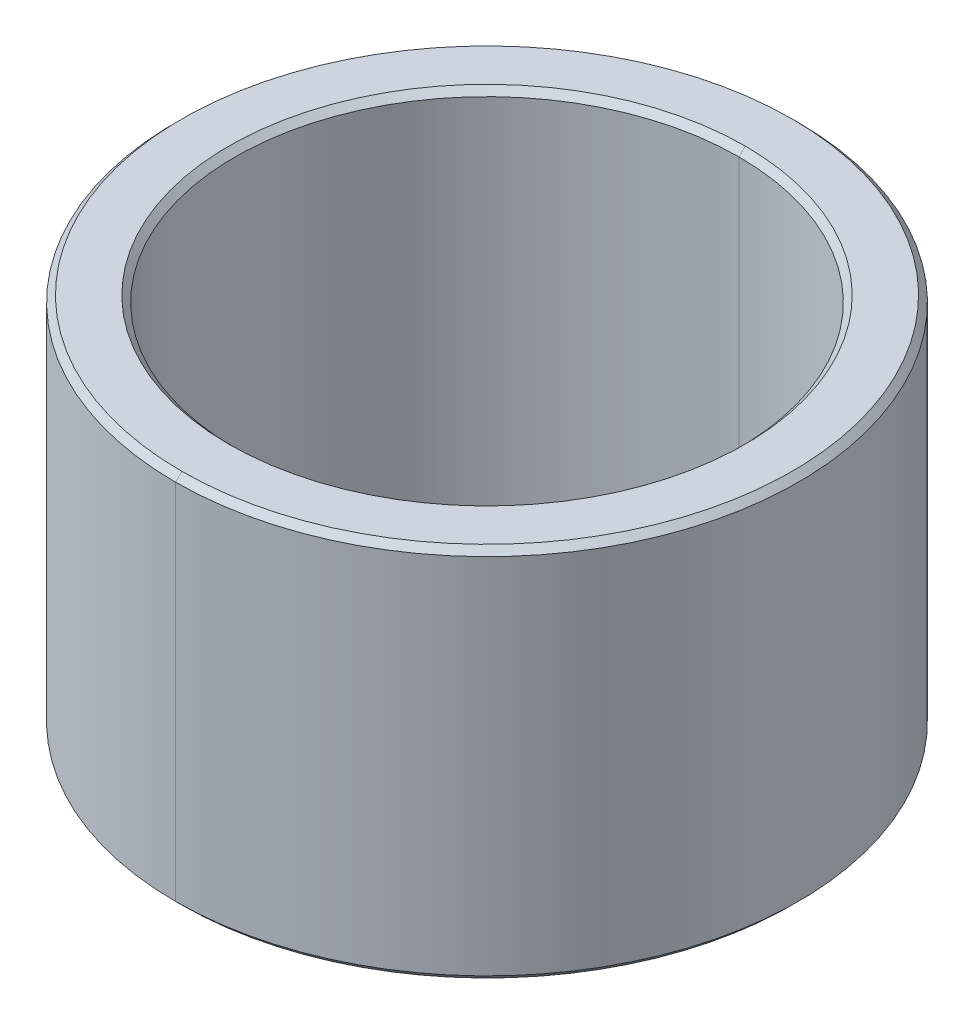
ISO-10303-21;
HEADER;
FILE_DESCRIPTION(('STEP AP214'),'2;1');
FILE_NAME('part.step','',(''),(''),'','','');
FILE_SCHEMA(('AUTOMOTIVE_DESIGN { 1 0 10303 214 1 1 1 1 }'));
ENDSEC;
DATA;
#1=APPLICATION_CONTEXT('core data for automotive mechanical design processes');
#2=APPLICATION_PROTOCOL_DEFINITION('international standard','automotive_design',2000,#1);
#3=PRODUCT_CONTEXT('',#1,'mechanical');
#4=PRODUCT('Part','Part','',(#3));
#5=PRODUCT_RELATED_PRODUCT_CATEGORY('part','',(#4));
#6=PRODUCT_DEFINITION_FORMATION('','',#4);
#7=PRODUCT_DEFINITION_CONTEXT('part definition',#1,'design');
#8=PRODUCT_DEFINITION('design','',#6,#7);
#9=PRODUCT_DEFINITION_SHAPE('','',#8);
#10=(LENGTH_UNIT() NAMED_UNIT(*) SI_UNIT(.MILLI.,.METRE.));
#11=(NAMED_UNIT(*) PLANE_ANGLE_UNIT() SI_UNIT($,.RADIAN.));
#12=(NAMED_UNIT(*) SI_UNIT($,.STERADIAN.) SOLID_ANGLE_UNIT());
#13=UNCERTAINTY_MEASURE_WITH_UNIT(LENGTH_MEASURE(1.E-05),#10,'distance_accuracy_value','');
#14=(GEOMETRIC_REPRESENTATION_CONTEXT(3) GLOBAL_UNCERTAINTY_ASSIGNED_CONTEXT((#13)) GLOBAL_UNIT_ASSIGNED_CONTEXT((#10,
#11,#12)) REPRESENTATION_CONTEXT('',''));
#15=CARTESIAN_POINT('',(0.,0.,0.));
#16=DIRECTION('',(0.,0.,1.));
#17=DIRECTION('',(1.,0.,0.));
#18=AXIS2_PLACEMENT_3D('',#15,#16,#17);
#19=CARTESIAN_POINT('',(0.,2.9,0.));
#20=DIRECTION('',(0.,1.,0.));
#21=DIRECTION('',(0.,0.,1.));
#22=AXIS2_PLACEMENT_3D('',#19,#20,#21);
#23=CONICAL_SURFACE('',#22,4.025,0.785398163397452);
#24=DIRECTION('',(0.,0.707106781186545,-0.707106781186551));
#25=VECTOR('',#24,1.);
#26=CARTESIAN_POINT('',(0.,2.9,-4.025));
#27=LINE('',#26,#25);
#28=CARTESIAN_POINT('',(0.,2.9,-4.025));
#29=VERTEX_POINT('',#28);
#30=CARTESIAN_POINT('',(0.,3.,-4.125));
#31=VERTEX_POINT('',#30);
#32=EDGE_CURVE('E218',#29,#31,#27,.T.);
#33=ORIENTED_EDGE('',*,*,#32,.F.);
#34=CARTESIAN_POINT('',(0.,2.9,0.));
#35=DIRECTION('',(0.,1.,0.));
#36=DIRECTION('',(0.,0.,1.));
#37=AXIS2_PLACEMENT_3D('',#34,#35,#36);
#38=CIRCLE('',#37,4.025);
#39=CARTESIAN_POINT('',(0.,2.9,4.025));
#40=VERTEX_POINT('',#39);
#41=EDGE_CURVE('E24',#40,#29,#38,.T.);
#42=ORIENTED_EDGE('',*,*,#41,.F.);
#43=DIRECTION('',(0.,0.707106781186545,0.707106781186551));
#44=VECTOR('',#43,1.);
#45=CARTESIAN_POINT('',(0.,2.9,4.025));
#46=LINE('',#45,#44);
#47=CARTESIAN_POINT('',(0.,3.,4.125));
#48=VERTEX_POINT('',#47);
#49=EDGE_CURVE('E204',#40,#48,#46,.T.);
#50=ORIENTED_EDGE('',*,*,#49,.T.);
#51=CARTESIAN_POINT('',(0.,3.,0.));
#52=DIRECTION('',(0.,-1.,0.));
#53=DIRECTION('',(0.,0.,1.));
#54=AXIS2_PLACEMENT_3D('',#51,#52,#53);
#55=CIRCLE('',#54,4.125);
#56=EDGE_CURVE('E110',#31,#48,#55,.T.);
#57=ORIENTED_EDGE('',*,*,#56,.F.);
#58=EDGE_LOOP('',(#33,#42,#50,#57));
#59=FACE_BOUND('',#58,.T.);
#60=ADVANCED_FACE('F15',(#59),#23,.F.);
#61=CARTESIAN_POINT('',(0.,-3.,0.));
#62=DIRECTION('',(0.,-1.,0.));
#63=DIRECTION('',(0.,0.,-1.));
#64=AXIS2_PLACEMENT_3D('',#61,#62,#63);
#65=CONICAL_SURFACE('',#64,4.125,0.785398163397452);
#66=DIRECTION('',(0.,-0.707106781186545,0.707106781186551));
#67=VECTOR('',#66,1.);
#68=CARTESIAN_POINT('',(0.,-3.,4.125));
#69=LINE('',#68,#67);
#70=CARTESIAN_POINT('',(0.,-2.9,4.025));
#71=VERTEX_POINT('',#70);
#72=CARTESIAN_POINT('',(0.,-3.,4.125));
#73=VERTEX_POINT('',#72);
#74=EDGE_CURVE('E185',#71,#73,#69,.T.);
#75=ORIENTED_EDGE('',*,*,#74,.F.);
#76=CARTESIAN_POINT('',(0.,-2.9,0.));
#77=DIRECTION('',(0.,-1.,0.));
#78=DIRECTION('',(0.,0.,1.));
#79=AXIS2_PLACEMENT_3D('',#76,#77,#78);
#80=CIRCLE('',#79,4.025);
#81=CARTESIAN_POINT('',(0.,-2.9,-4.025));
#82=VERTEX_POINT('',#81);
#83=EDGE_CURVE('E9',#82,#71,#80,.T.);
#84=ORIENTED_EDGE('',*,*,#83,.F.);
#85=DIRECTION('',(0.,-0.707106781186545,-0.707106781186551));
#86=VECTOR('',#85,1.);
#87=CARTESIAN_POINT('',(0.,-3.,-4.125));
#88=LINE('',#87,#86);
#89=CARTESIAN_POINT('',(0.,-3.,-4.125));
#90=VERTEX_POINT('',#89);
#91=EDGE_CURVE('E173',#82,#90,#88,.T.);
#92=ORIENTED_EDGE('',*,*,#91,.T.);
#93=CARTESIAN_POINT('',(0.,-3.,0.));
#94=DIRECTION('',(0.,1.,0.));
#95=DIRECTION('',(0.,0.,1.));
#96=AXIS2_PLACEMENT_3D('',#93,#94,#95);
#97=CIRCLE('',#96,4.125);
#98=EDGE_CURVE('E109',#73,#90,#97,.T.);
#99=ORIENTED_EDGE('',*,*,#98,.F.);
#100=EDGE_LOOP('',(#75,#84,#92,#99));
#101=FACE_BOUND('',#100,.T.);
#102=ADVANCED_FACE('F263',(#101),#65,.F.);
#103=CARTESIAN_POINT('',(0.,3.,0.));
#104=DIRECTION('',(0.,-1.,0.));
#105=DIRECTION('',(0.,0.,-1.));
#106=AXIS2_PLACEMENT_3D('',#103,#104,#105);
#107=CONICAL_SURFACE('',#106,4.875,0.785398163397452);
#108=DIRECTION('',(0.,-0.707106781186545,0.707106781186551));
#109=VECTOR('',#108,1.);
#110=CARTESIAN_POINT('',(0.,3.,4.875));
#111=LINE('',#110,#109);
#112=CARTESIAN_POINT('',(0.,3.,4.875));
#113=VERTEX_POINT('',#112);
#114=CARTESIAN_POINT('',(0.,2.9,4.975));
#115=VERTEX_POINT('',#114);
#116=EDGE_CURVE('E166',#113,#115,#111,.T.);
#117=ORIENTED_EDGE('',*,*,#116,.F.);
#118=CARTESIAN_POINT('',(0.,3.,0.));
#119=DIRECTION('',(0.,1.,0.));
#120=DIRECTION('',(0.,0.,1.));
#121=AXIS2_PLACEMENT_3D('',#118,#119,#120);
#122=CIRCLE('',#121,4.875);
#123=CARTESIAN_POINT('',(0.,3.,-4.875));
#124=VERTEX_POINT('',#123);
#125=EDGE_CURVE('E144',#124,#113,#122,.T.);
#126=ORIENTED_EDGE('',*,*,#125,.F.);
#127=DIRECTION('',(0.,-0.707106781186545,-0.707106781186551));
#128=VECTOR('',#127,1.);
#129=CARTESIAN_POINT('',(0.,3.,-4.875));
#130=LINE('',#129,#128);
#131=CARTESIAN_POINT('',(0.,2.9,-4.975));
#132=VERTEX_POINT('',#131);
#133=EDGE_CURVE('E122',#124,#132,#130,.T.);
#134=ORIENTED_EDGE('',*,*,#133,.T.);
#135=CARTESIAN_POINT('',(0.,2.9,0.));
#136=DIRECTION('',(0.,-1.,0.));
#137=DIRECTION('',(0.,0.,1.));
#138=AXIS2_PLACEMENT_3D('',#135,#136,#137);
#139=CIRCLE('',#138,4.975);
#140=EDGE_CURVE('E18',#115,#132,#139,.T.);
#141=ORIENTED_EDGE('',*,*,#140,.F.);
#142=EDGE_LOOP('',(#117,#126,#134,#141));
#143=FACE_BOUND('',#142,.T.);
#144=ADVANCED_FACE('F167',(#143),#107,.T.);
#145=CARTESIAN_POINT('',(0.,-2.9,0.));
#146=DIRECTION('',(0.,1.,0.));
#147=DIRECTION('',(0.,0.,1.));
#148=AXIS2_PLACEMENT_3D('',#145,#146,#147);
#149=CONICAL_SURFACE('',#148,4.975,0.785398163397443);
#150=DIRECTION('',(0.,0.707106781186551,-0.707106781186545));
#151=VECTOR('',#150,1.);
#152=CARTESIAN_POINT('',(0.,-2.9,-4.975));
#153=LINE('',#152,#151);
#154=CARTESIAN_POINT('',(0.,-3.,-4.875));
#155=VERTEX_POINT('',#154);
#156=CARTESIAN_POINT('',(0.,-2.9,-4.975));
#157=VERTEX_POINT('',#156);
#158=EDGE_CURVE('E112',#155,#157,#153,.T.);
#159=ORIENTED_EDGE('',*,*,#158,.F.);
#160=CARTESIAN_POINT('',(0.,-3.,0.));
#161=DIRECTION('',(0.,-1.,0.));
#162=DIRECTION('',(0.,0.,1.));
#163=AXIS2_PLACEMENT_3D('',#160,#161,#162);
#164=CIRCLE('',#163,4.875);
#165=CARTESIAN_POINT('',(0.,-3.,4.875));
#166=VERTEX_POINT('',#165);
#167=EDGE_CURVE('E103',#166,#155,#164,.T.);
#168=ORIENTED_EDGE('',*,*,#167,.F.);
#169=DIRECTION('',(0.,0.707106781186551,0.707106781186545));
#170=VECTOR('',#169,1.);
#171=CARTESIAN_POINT('',(0.,-2.9,4.975));
#172=LINE('',#171,#170);
#173=CARTESIAN_POINT('',(0.,-2.9,4.975));
#174=VERTEX_POINT('',#173);
#175=EDGE_CURVE('E120',#166,#174,#172,.T.);
#176=ORIENTED_EDGE('',*,*,#175,.T.);
#177=CARTESIAN_POINT('',(0.,-2.9,0.));
#178=DIRECTION('',(0.,1.,0.));
#179=DIRECTION('',(0.,0.,1.));
#180=AXIS2_PLACEMENT_3D('',#177,#178,#179);
#181=CIRCLE('',#180,4.975);
#182=EDGE_CURVE('E38',#157,#174,#181,.T.);
#183=ORIENTED_EDGE('',*,*,#182,.F.);
#184=EDGE_LOOP('',(#159,#168,#176,#183));
#185=FACE_BOUND('',#184,.T.);
#186=ADVANCED_FACE('F113',(#185),#149,.T.);
#187=CARTESIAN_POINT('',(0.,3.,0.));
#188=DIRECTION('',(0.,-1.,0.));
#189=DIRECTION('',(0.,0.,-1.));
#190=AXIS2_PLACEMENT_3D('',#187,#188,#189);
#191=CYLINDRICAL_SURFACE('',#190,4.025);
#192=DIRECTION('',(0.,-1.,0.));
#193=VECTOR('',#192,1.);
#194=CARTESIAN_POINT('',(0.,3.,4.025));
#195=LINE('',#194,#193);
#196=EDGE_CURVE('E134',#40,#71,#195,.T.);
#197=ORIENTED_EDGE('',*,*,#196,.F.);
#198=ORIENTED_EDGE('',*,*,#41,.T.);
#199=DIRECTION('',(0.,-1.,0.));
#200=VECTOR('',#199,1.);
#201=CARTESIAN_POINT('',(0.,3.,-4.025));
#202=LINE('',#201,#200);
#203=EDGE_CURVE('E138',#29,#82,#202,.T.);
#204=ORIENTED_EDGE('',*,*,#203,.T.);
#205=ORIENTED_EDGE('',*,*,#83,.T.);
#206=EDGE_LOOP('',(#197,#198,#204,#205));
#207=FACE_BOUND('',#206,.T.);
#208=ADVANCED_FACE('F245',(#207),#191,.F.);
#209=CARTESIAN_POINT('',(0.,3.,0.));
#210=DIRECTION('',(0.,-1.,0.));
#211=DIRECTION('',(0.,0.,-1.));
#212=AXIS2_PLACEMENT_3D('',#209,#210,#211);
#213=CYLINDRICAL_SURFACE('',#212,4.975);
#214=DIRECTION('',(0.,-1.,0.));
#215=VECTOR('',#214,1.);
#216=CARTESIAN_POINT('',(0.,3.,4.975));
#217=LINE('',#216,#215);
#218=EDGE_CURVE('E148',#115,#174,#217,.T.);
#219=ORIENTED_EDGE('',*,*,#218,.F.);
#220=ORIENTED_EDGE('',*,*,#140,.T.);
#221=DIRECTION('',(0.,-1.,0.));
#222=VECTOR('',#221,1.);
#223=CARTESIAN_POINT('',(0.,3.,-4.975));
#224=LINE('',#223,#222);
#225=EDGE_CURVE('E151',#132,#157,#224,.T.);
#226=ORIENTED_EDGE('',*,*,#225,.T.);
#227=ORIENTED_EDGE('',*,*,#182,.T.);
#228=EDGE_LOOP('',(#219,#220,#226,#227));
#229=FACE_BOUND('',#228,.T.);
#230=ADVANCED_FACE('F259',(#229),#213,.T.);
#231=CARTESIAN_POINT('',(0.,-3.,0.));
#232=DIRECTION('',(0.,1.,0.));
#233=DIRECTION('',(1.,0.,0.));
#234=AXIS2_PLACEMENT_3D('',#231,#232,#233);
#235=PLANE('',#234);
#236=CARTESIAN_POINT('',(0.,-3.,0.));
#237=DIRECTION('',(0.,1.,0.));
#238=DIRECTION('',(0.,0.,1.));
#239=AXIS2_PLACEMENT_3D('',#236,#237,#238);
#240=CIRCLE('',#239,4.125);
#241=EDGE_CURVE('E181',#90,#73,#240,.T.);
#242=ORIENTED_EDGE('',*,*,#241,.T.);
#243=ORIENTED_EDGE('',*,*,#98,.T.);
#244=EDGE_LOOP('',(#242,#243));
#245=FACE_BOUND('',#244,.T.);
#246=ORIENTED_EDGE('',*,*,#167,.T.);
#247=CARTESIAN_POINT('',(0.,-3.,0.));
#248=DIRECTION('',(0.,-1.,0.));
#249=DIRECTION('',(0.,0.,1.));
#250=AXIS2_PLACEMENT_3D('',#247,#248,#249);
#251=CIRCLE('',#250,4.875);
#252=EDGE_CURVE('E106',#155,#166,#251,.T.);
#253=ORIENTED_EDGE('',*,*,#252,.T.);
#254=EDGE_LOOP('',(#246,#253));
#255=FACE_BOUND('',#254,.T.);
#256=ADVANCED_FACE('F104',(#245,#255),#235,.F.);
#257=CARTESIAN_POINT('',(0.,3.,0.));
#258=DIRECTION('',(0.,1.,0.));
#259=DIRECTION('',(1.,0.,0.));
#260=AXIS2_PLACEMENT_3D('',#257,#258,#259);
#261=PLANE('',#260);
#262=CARTESIAN_POINT('',(0.,3.,0.));
#263=DIRECTION('',(0.,-1.,0.));
#264=DIRECTION('',(0.,0.,1.));
#265=AXIS2_PLACEMENT_3D('',#262,#263,#264);
#266=CIRCLE('',#265,4.125);
#267=EDGE_CURVE('E211',#48,#31,#266,.T.);
#268=ORIENTED_EDGE('',*,*,#267,.T.);
#269=ORIENTED_EDGE('',*,*,#56,.T.);
#270=EDGE_LOOP('',(#268,#269));
#271=FACE_BOUND('',#270,.T.);
#272=ORIENTED_EDGE('',*,*,#125,.T.);
#273=CARTESIAN_POINT('',(0.,3.,0.));
#274=DIRECTION('',(0.,1.,0.));
#275=DIRECTION('',(0.,0.,1.));
#276=AXIS2_PLACEMENT_3D('',#273,#274,#275);
#277=CIRCLE('',#276,4.875);
#278=EDGE_CURVE('E162',#113,#124,#277,.T.);
#279=ORIENTED_EDGE('',*,*,#278,.T.);
#280=EDGE_LOOP('',(#272,#279));
#281=FACE_BOUND('',#280,.T.);
#282=ADVANCED_FACE('F160',(#271,#281),#261,.T.);
#283=CARTESIAN_POINT('',(0.,3.,0.));
#284=DIRECTION('',(0.,-1.,0.));
#285=DIRECTION('',(0.,0.,-1.));
#286=AXIS2_PLACEMENT_3D('',#283,#284,#285);
#287=CYLINDRICAL_SURFACE('',#286,4.975);
#288=CARTESIAN_POINT('',(0.,2.9,0.));
#289=DIRECTION('',(0.,-1.,0.));
#290=DIRECTION('',(0.,0.,1.));
#291=AXIS2_PLACEMENT_3D('',#288,#289,#290);
#292=CIRCLE('',#291,4.975);
#293=EDGE_CURVE('E129',#132,#115,#292,.T.);
#294=ORIENTED_EDGE('',*,*,#293,.T.);
#295=ORIENTED_EDGE('',*,*,#218,.T.);
#296=CARTESIAN_POINT('',(0.,-2.9,0.));
#297=DIRECTION('',(0.,1.,0.));
#298=DIRECTION('',(0.,0.,1.));
#299=AXIS2_PLACEMENT_3D('',#296,#297,#298);
#300=CIRCLE('',#299,4.975);
#301=EDGE_CURVE('E117',#174,#157,#300,.T.);
#302=ORIENTED_EDGE('',*,*,#301,.T.);
#303=ORIENTED_EDGE('',*,*,#225,.F.);
#304=EDGE_LOOP('',(#294,#295,#302,#303));
#305=FACE_BOUND('',#304,.T.);
#306=ADVANCED_FACE('F250',(#305),#287,.T.);
#307=CARTESIAN_POINT('',(0.,3.,0.));
#308=DIRECTION('',(0.,-1.,0.));
#309=DIRECTION('',(0.,0.,-1.));
#310=AXIS2_PLACEMENT_3D('',#307,#308,#309);
#311=CYLINDRICAL_SURFACE('',#310,4.025);
#312=CARTESIAN_POINT('',(0.,2.9,0.));
#313=DIRECTION('',(0.,1.,0.));
#314=DIRECTION('',(0.,0.,1.));
#315=AXIS2_PLACEMENT_3D('',#312,#313,#314);
#316=CIRCLE('',#315,4.025);
#317=EDGE_CURVE('E223',#29,#40,#316,.T.);
#318=ORIENTED_EDGE('',*,*,#317,.T.);
#319=ORIENTED_EDGE('',*,*,#196,.T.);
#320=CARTESIAN_POINT('',(0.,-2.9,0.));
#321=DIRECTION('',(0.,-1.,0.));
#322=DIRECTION('',(0.,0.,1.));
#323=AXIS2_PLACEMENT_3D('',#320,#321,#322);
#324=CIRCLE('',#323,4.025);
#325=EDGE_CURVE('E196',#71,#82,#324,.T.);
#326=ORIENTED_EDGE('',*,*,#325,.T.);
#327=ORIENTED_EDGE('',*,*,#203,.F.);
#328=EDGE_LOOP('',(#318,#319,#326,#327));
#329=FACE_BOUND('',#328,.T.);
#330=ADVANCED_FACE('F234',(#329),#311,.F.);
#331=CARTESIAN_POINT('',(0.,-2.9,0.));
#332=DIRECTION('',(0.,1.,0.));
#333=DIRECTION('',(0.,0.,1.));
#334=AXIS2_PLACEMENT_3D('',#331,#332,#333);
#335=CONICAL_SURFACE('',#334,4.975,0.785398163397443);
#336=ORIENTED_EDGE('',*,*,#252,.F.);
#337=ORIENTED_EDGE('',*,*,#158,.T.);
#338=ORIENTED_EDGE('',*,*,#301,.F.);
#339=ORIENTED_EDGE('',*,*,#175,.F.);
#340=EDGE_LOOP('',(#336,#337,#338,#339));
#341=FACE_BOUND('',#340,.T.);
#342=ADVANCED_FACE('F119',(#341),#335,.T.);
#343=CARTESIAN_POINT('',(0.,3.,0.));
#344=DIRECTION('',(0.,-1.,0.));
#345=DIRECTION('',(0.,0.,-1.));
#346=AXIS2_PLACEMENT_3D('',#343,#344,#345);
#347=CONICAL_SURFACE('',#346,4.875,0.785398163397452);
#348=ORIENTED_EDGE('',*,*,#278,.F.);
#349=ORIENTED_EDGE('',*,*,#116,.T.);
#350=ORIENTED_EDGE('',*,*,#293,.F.);
#351=ORIENTED_EDGE('',*,*,#133,.F.);
#352=EDGE_LOOP('',(#348,#349,#350,#351));
#353=FACE_BOUND('',#352,.T.);
#354=ADVANCED_FACE('F171',(#353),#347,.T.);
#355=CARTESIAN_POINT('',(0.,-3.,0.));
#356=DIRECTION('',(0.,-1.,0.));
#357=DIRECTION('',(0.,0.,-1.));
#358=AXIS2_PLACEMENT_3D('',#355,#356,#357);
#359=CONICAL_SURFACE('',#358,4.125,0.785398163397452);
#360=ORIENTED_EDGE('',*,*,#325,.F.);
#361=ORIENTED_EDGE('',*,*,#74,.T.);
#362=ORIENTED_EDGE('',*,*,#241,.F.);
#363=ORIENTED_EDGE('',*,*,#91,.F.);
#364=EDGE_LOOP('',(#360,#361,#362,#363));
#365=FACE_BOUND('',#364,.T.);
#366=ADVANCED_FACE('F274',(#365),#359,.F.);
#367=CARTESIAN_POINT('',(0.,2.9,0.));
#368=DIRECTION('',(0.,1.,0.));
#369=DIRECTION('',(0.,0.,1.));
#370=AXIS2_PLACEMENT_3D('',#367,#368,#369);
#371=CONICAL_SURFACE('',#370,4.025,0.785398163397452);
#372=ORIENTED_EDGE('',*,*,#317,.F.);
#373=ORIENTED_EDGE('',*,*,#32,.T.);
#374=ORIENTED_EDGE('',*,*,#267,.F.);
#375=ORIENTED_EDGE('',*,*,#49,.F.);
#376=EDGE_LOOP('',(#372,#373,#374,#375));
#377=FACE_BOUND('',#376,.T.);
#378=ADVANCED_FACE('F239',(#377),#371,.F.);
#379=CLOSED_SHELL('',(#60,#102,#144,#186,#208,#230,#256,#282,#306,#330,#342,#354,#366,#378));
#380=MANIFOLD_SOLID_BREP('B1',#379);
#381=ADVANCED_BREP_SHAPE_REPRESENTATION('',(#18,#380),#14);
#382=SHAPE_DEFINITION_REPRESENTATION(#9,#381);
ENDSEC;
END-ISO-10303-21;
